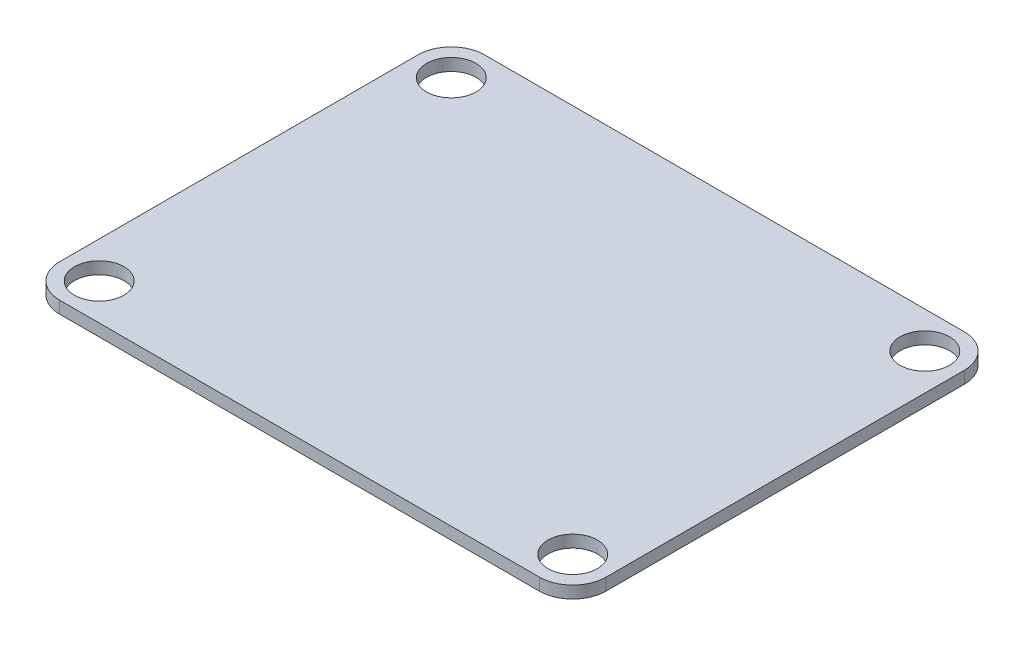
ISO-10303-21;
HEADER;
FILE_DESCRIPTION(('STEP AP214'),'2;1');
FILE_NAME('part.step','',(''),(''),'','','');
FILE_SCHEMA(('AUTOMOTIVE_DESIGN { 1 0 10303 214 1 1 1 1 }'));
ENDSEC;
DATA;
#1=APPLICATION_CONTEXT('core data for automotive mechanical design processes');
#2=APPLICATION_PROTOCOL_DEFINITION('international standard','automotive_design',2000,#1);
#3=PRODUCT_CONTEXT('',#1,'mechanical');
#4=PRODUCT('Part','Part','',(#3));
#5=PRODUCT_RELATED_PRODUCT_CATEGORY('part','',(#4));
#6=PRODUCT_DEFINITION_FORMATION('','',#4);
#7=PRODUCT_DEFINITION_CONTEXT('part definition',#1,'design');
#8=PRODUCT_DEFINITION('design','',#6,#7);
#9=PRODUCT_DEFINITION_SHAPE('','',#8);
#10=(LENGTH_UNIT() NAMED_UNIT(*) SI_UNIT(.MILLI.,.METRE.));
#11=(NAMED_UNIT(*) PLANE_ANGLE_UNIT() SI_UNIT($,.RADIAN.));
#12=(NAMED_UNIT(*) SI_UNIT($,.STERADIAN.) SOLID_ANGLE_UNIT());
#13=UNCERTAINTY_MEASURE_WITH_UNIT(LENGTH_MEASURE(1.E-05),#10,'distance_accuracy_value','');
#14=(GEOMETRIC_REPRESENTATION_CONTEXT(3) GLOBAL_UNCERTAINTY_ASSIGNED_CONTEXT((#13)) GLOBAL_UNIT_ASSIGNED_CONTEXT((#10,
#11,#12)) REPRESENTATION_CONTEXT('',''));
#15=CARTESIAN_POINT('',(0.,0.,0.));
#16=DIRECTION('',(0.,0.,1.));
#17=DIRECTION('',(1.,0.,0.));
#18=AXIS2_PLACEMENT_3D('',#15,#16,#17);
#19=CARTESIAN_POINT('',(114.3,5.08,-88.9));
#20=DIRECTION('',(-1.,0.,0.));
#21=DIRECTION('',(0.,0.,1.));
#22=AXIS2_PLACEMENT_3D('',#19,#20,#21);
#23=PLANE('',#22);
#24=DIRECTION('',(0.,0.,-1.));
#25=VECTOR('',#24,1.);
#26=CARTESIAN_POINT('',(114.3,0.,-88.9));
#27=LINE('',#26,#25);
#28=CARTESIAN_POINT('',(114.3,0.,74.93));
#29=VERTEX_POINT('',#28);
#30=CARTESIAN_POINT('',(114.3,0.,-74.93));
#31=VERTEX_POINT('',#30);
#32=EDGE_CURVE('E134',#29,#31,#27,.T.);
#33=ORIENTED_EDGE('',*,*,#32,.T.);
#34=DIRECTION('',(0.,-1.,0.));
#35=VECTOR('',#34,1.);
#36=CARTESIAN_POINT('',(114.3,5.08,-74.93));
#37=LINE('',#36,#35);
#38=CARTESIAN_POINT('',(114.3,5.08,-74.93));
#39=VERTEX_POINT('',#38);
#40=EDGE_CURVE('E111',#31,#39,#37,.F.);
#41=ORIENTED_EDGE('',*,*,#40,.T.);
#42=DIRECTION('',(0.,0.,-1.));
#43=VECTOR('',#42,1.);
#44=CARTESIAN_POINT('',(114.3,5.08,-88.9));
#45=LINE('',#44,#43);
#46=CARTESIAN_POINT('',(114.3,5.08,74.93));
#47=VERTEX_POINT('',#46);
#48=EDGE_CURVE('E144',#47,#39,#45,.T.);
#49=ORIENTED_EDGE('',*,*,#48,.F.);
#50=DIRECTION('',(0.,-1.,0.));
#51=VECTOR('',#50,1.);
#52=CARTESIAN_POINT('',(114.3,5.08,74.93));
#53=LINE('',#52,#51);
#54=EDGE_CURVE('E116',#47,#29,#53,.T.);
#55=ORIENTED_EDGE('',*,*,#54,.T.);
#56=EDGE_LOOP('',(#33,#41,#49,#55));
#57=FACE_BOUND('',#56,.T.);
#58=ADVANCED_FACE('F39',(#57),#23,.F.);
#59=CARTESIAN_POINT('',(-114.3,5.08,-88.9));
#60=DIRECTION('',(0.,0.,1.));
#61=DIRECTION('',(1.,0.,0.));
#62=AXIS2_PLACEMENT_3D('',#59,#60,#61);
#63=PLANE('',#62);
#64=DIRECTION('',(-1.,0.,0.));
#65=VECTOR('',#64,1.);
#66=CARTESIAN_POINT('',(-114.3,5.08,-88.9));
#67=LINE('',#66,#65);
#68=CARTESIAN_POINT('',(100.33,5.08,-88.9));
#69=VERTEX_POINT('',#68);
#70=CARTESIAN_POINT('',(-100.33,5.08,-88.9));
#71=VERTEX_POINT('',#70);
#72=EDGE_CURVE('E126',#69,#71,#67,.T.);
#73=ORIENTED_EDGE('',*,*,#72,.F.);
#74=DIRECTION('',(0.,-1.,0.));
#75=VECTOR('',#74,1.);
#76=CARTESIAN_POINT('',(100.33,5.08,-88.9));
#77=LINE('',#76,#75);
#78=CARTESIAN_POINT('',(100.33,0.,-88.9));
#79=VERTEX_POINT('',#78);
#80=EDGE_CURVE('E110',#69,#79,#77,.T.);
#81=ORIENTED_EDGE('',*,*,#80,.T.);
#82=DIRECTION('',(-1.,0.,0.));
#83=VECTOR('',#82,1.);
#84=CARTESIAN_POINT('',(-114.3,0.,-88.9));
#85=LINE('',#84,#83);
#86=CARTESIAN_POINT('',(-100.33,0.,-88.9));
#87=VERTEX_POINT('',#86);
#88=EDGE_CURVE('E123',#79,#87,#85,.T.);
#89=ORIENTED_EDGE('',*,*,#88,.T.);
#90=DIRECTION('',(0.,-1.,0.));
#91=VECTOR('',#90,1.);
#92=CARTESIAN_POINT('',(-100.33,5.08,-88.9));
#93=LINE('',#92,#91);
#94=EDGE_CURVE('E128',#87,#71,#93,.F.);
#95=ORIENTED_EDGE('',*,*,#94,.T.);
#96=EDGE_LOOP('',(#73,#81,#89,#95));
#97=FACE_BOUND('',#96,.T.);
#98=ADVANCED_FACE('F122',(#97),#63,.F.);
#99=CARTESIAN_POINT('',(-114.3,5.08,-88.9));
#100=DIRECTION('',(1.,0.,0.));
#101=DIRECTION('',(0.,0.,-1.));
#102=AXIS2_PLACEMENT_3D('',#99,#100,#101);
#103=PLANE('',#102);
#104=DIRECTION('',(0.,0.,1.));
#105=VECTOR('',#104,1.);
#106=CARTESIAN_POINT('',(-114.3,5.08,-88.9));
#107=LINE('',#106,#105);
#108=CARTESIAN_POINT('',(-114.3,5.08,-74.93));
#109=VERTEX_POINT('',#108);
#110=CARTESIAN_POINT('',(-114.3,5.08,74.93));
#111=VERTEX_POINT('',#110);
#112=EDGE_CURVE('E167',#109,#111,#107,.T.);
#113=ORIENTED_EDGE('',*,*,#112,.F.);
#114=DIRECTION('',(0.,-1.,0.));
#115=VECTOR('',#114,1.);
#116=CARTESIAN_POINT('',(-114.3,5.08,-74.93));
#117=LINE('',#116,#115);
#118=CARTESIAN_POINT('',(-114.3,0.,-74.93));
#119=VERTEX_POINT('',#118);
#120=EDGE_CURVE('E11',#109,#119,#117,.T.);
#121=ORIENTED_EDGE('',*,*,#120,.T.);
#122=DIRECTION('',(0.,0.,1.));
#123=VECTOR('',#122,1.);
#124=CARTESIAN_POINT('',(-114.3,0.,-88.9));
#125=LINE('',#124,#123);
#126=CARTESIAN_POINT('',(-114.3,0.,74.93));
#127=VERTEX_POINT('',#126);
#128=EDGE_CURVE('E133',#119,#127,#125,.T.);
#129=ORIENTED_EDGE('',*,*,#128,.T.);
#130=DIRECTION('',(0.,-1.,0.));
#131=VECTOR('',#130,1.);
#132=CARTESIAN_POINT('',(-114.3,5.08,74.93));
#133=LINE('',#132,#131);
#134=EDGE_CURVE('E47',#127,#111,#133,.F.);
#135=ORIENTED_EDGE('',*,*,#134,.T.);
#136=EDGE_LOOP('',(#113,#121,#129,#135));
#137=FACE_BOUND('',#136,.T.);
#138=ADVANCED_FACE('F166',(#137),#103,.F.);
#139=CARTESIAN_POINT('',(-114.3,5.08,88.9));
#140=DIRECTION('',(0.,0.,-1.));
#141=DIRECTION('',(-1.,0.,0.));
#142=AXIS2_PLACEMENT_3D('',#139,#140,#141);
#143=PLANE('',#142);
#144=DIRECTION('',(1.,0.,0.));
#145=VECTOR('',#144,1.);
#146=CARTESIAN_POINT('',(-114.3,0.,88.9));
#147=LINE('',#146,#145);
#148=CARTESIAN_POINT('',(-100.33,0.,88.9));
#149=VERTEX_POINT('',#148);
#150=CARTESIAN_POINT('',(100.33,0.,88.9));
#151=VERTEX_POINT('',#150);
#152=EDGE_CURVE('E137',#149,#151,#147,.T.);
#153=ORIENTED_EDGE('',*,*,#152,.T.);
#154=DIRECTION('',(0.,-1.,0.));
#155=VECTOR('',#154,1.);
#156=CARTESIAN_POINT('',(100.33,5.08,88.9));
#157=LINE('',#156,#155);
#158=CARTESIAN_POINT('',(100.33,5.08,88.9));
#159=VERTEX_POINT('',#158);
#160=EDGE_CURVE('E54',#151,#159,#157,.F.);
#161=ORIENTED_EDGE('',*,*,#160,.T.);
#162=DIRECTION('',(1.,0.,0.));
#163=VECTOR('',#162,1.);
#164=CARTESIAN_POINT('',(-114.3,5.08,88.9));
#165=LINE('',#164,#163);
#166=CARTESIAN_POINT('',(-100.33,5.08,88.9));
#167=VERTEX_POINT('',#166);
#168=EDGE_CURVE('E145',#167,#159,#165,.T.);
#169=ORIENTED_EDGE('',*,*,#168,.F.);
#170=DIRECTION('',(0.,-1.,0.));
#171=VECTOR('',#170,1.);
#172=CARTESIAN_POINT('',(-100.33,5.08,88.9));
#173=LINE('',#172,#171);
#174=EDGE_CURVE('E160',#167,#149,#173,.T.);
#175=ORIENTED_EDGE('',*,*,#174,.T.);
#176=EDGE_LOOP('',(#153,#161,#169,#175));
#177=FACE_BOUND('',#176,.T.);
#178=ADVANCED_FACE('F176',(#177),#143,.F.);
#179=CARTESIAN_POINT('',(0.,5.08,0.));
#180=DIRECTION('',(0.,1.,0.));
#181=DIRECTION('',(0.,0.,1.));
#182=AXIS2_PLACEMENT_3D('',#179,#180,#181);
#183=PLANE('',#182);
#184=CARTESIAN_POINT('',(-99.06,5.08,73.66));
#185=DIRECTION('',(0.,1.,0.));
#186=DIRECTION('',(0.,0.,1.));
#187=AXIS2_PLACEMENT_3D('',#184,#185,#186);
#188=CIRCLE('',#187,10.3505);
#189=CARTESIAN_POINT('',(-99.06,5.08,84.0105));
#190=VERTEX_POINT('',#189);
#191=EDGE_CURVE('E195',#190,#190,#188,.T.);
#192=ORIENTED_EDGE('',*,*,#191,.F.);
#193=EDGE_LOOP('',(#192));
#194=FACE_BOUND('',#193,.T.);
#195=CARTESIAN_POINT('',(99.06,5.08,73.66));
#196=DIRECTION('',(0.,1.,0.));
#197=DIRECTION('',(0.,0.,1.));
#198=AXIS2_PLACEMENT_3D('',#195,#196,#197);
#199=CIRCLE('',#198,10.3505);
#200=CARTESIAN_POINT('',(99.06,5.08,84.0105));
#201=VERTEX_POINT('',#200);
#202=EDGE_CURVE('E201',#201,#201,#199,.T.);
#203=ORIENTED_EDGE('',*,*,#202,.F.);
#204=EDGE_LOOP('',(#203));
#205=FACE_BOUND('',#204,.T.);
#206=CARTESIAN_POINT('',(99.06,5.08,-73.66));
#207=DIRECTION('',(0.,1.,0.));
#208=DIRECTION('',(0.,0.,1.));
#209=AXIS2_PLACEMENT_3D('',#206,#207,#208);
#210=CIRCLE('',#209,10.3505);
#211=CARTESIAN_POINT('',(99.06,5.08,-63.3095));
#212=VERTEX_POINT('',#211);
#213=EDGE_CURVE('E189',#212,#212,#210,.T.);
#214=ORIENTED_EDGE('',*,*,#213,.F.);
#215=EDGE_LOOP('',(#214));
#216=FACE_BOUND('',#215,.T.);
#217=CARTESIAN_POINT('',(-99.06,5.08,-73.66));
#218=DIRECTION('',(0.,1.,0.));
#219=DIRECTION('',(0.,0.,1.));
#220=AXIS2_PLACEMENT_3D('',#217,#218,#219);
#221=CIRCLE('',#220,10.3505);
#222=CARTESIAN_POINT('',(-99.06,5.08,-63.3095));
#223=VERTEX_POINT('',#222);
#224=EDGE_CURVE('E186',#223,#223,#221,.T.);
#225=ORIENTED_EDGE('',*,*,#224,.F.);
#226=EDGE_LOOP('',(#225));
#227=FACE_BOUND('',#226,.T.);
#228=ORIENTED_EDGE('',*,*,#48,.T.);
#229=CARTESIAN_POINT('',(100.33,5.08,-74.93));
#230=DIRECTION('',(0.,1.,0.));
#231=DIRECTION('',(0.,0.,1.));
#232=AXIS2_PLACEMENT_3D('',#229,#230,#231);
#233=CIRCLE('',#232,13.97);
#234=EDGE_CURVE('E158',#39,#69,#233,.T.);
#235=ORIENTED_EDGE('',*,*,#234,.T.);
#236=ORIENTED_EDGE('',*,*,#72,.T.);
#237=CARTESIAN_POINT('',(-100.33,5.08,-74.93));
#238=DIRECTION('',(0.,1.,0.));
#239=DIRECTION('',(0.,0.,1.));
#240=AXIS2_PLACEMENT_3D('',#237,#238,#239);
#241=CIRCLE('',#240,13.97);
#242=EDGE_CURVE('E154',#71,#109,#241,.T.);
#243=ORIENTED_EDGE('',*,*,#242,.T.);
#244=ORIENTED_EDGE('',*,*,#112,.T.);
#245=CARTESIAN_POINT('',(-100.33,5.08,74.93));
#246=DIRECTION('',(0.,1.,0.));
#247=DIRECTION('',(0.,0.,1.));
#248=AXIS2_PLACEMENT_3D('',#245,#246,#247);
#249=CIRCLE('',#248,13.97);
#250=EDGE_CURVE('E61',#111,#167,#249,.T.);
#251=ORIENTED_EDGE('',*,*,#250,.T.);
#252=ORIENTED_EDGE('',*,*,#168,.T.);
#253=CARTESIAN_POINT('',(100.33,5.08,74.93));
#254=DIRECTION('',(0.,1.,0.));
#255=DIRECTION('',(0.,0.,1.));
#256=AXIS2_PLACEMENT_3D('',#253,#254,#255);
#257=CIRCLE('',#256,13.97);
#258=EDGE_CURVE('E156',#159,#47,#257,.T.);
#259=ORIENTED_EDGE('',*,*,#258,.T.);
#260=EDGE_LOOP('',(#228,#235,#236,#243,#244,#251,#252,#259));
#261=FACE_BOUND('',#260,.T.);
#262=ADVANCED_FACE('F171',(#194,#205,#216,#227,#261),#183,.T.);
#263=CARTESIAN_POINT('',(0.,0.,0.));
#264=DIRECTION('',(0.,1.,0.));
#265=DIRECTION('',(0.,0.,1.));
#266=AXIS2_PLACEMENT_3D('',#263,#264,#265);
#267=PLANE('',#266);
#268=CARTESIAN_POINT('',(-99.06,0.,73.66));
#269=DIRECTION('',(0.,1.,0.));
#270=DIRECTION('',(0.,0.,1.));
#271=AXIS2_PLACEMENT_3D('',#268,#269,#270);
#272=CIRCLE('',#271,10.3505);
#273=CARTESIAN_POINT('',(-99.06,0.,84.0105));
#274=VERTEX_POINT('',#273);
#275=EDGE_CURVE('E192',#274,#274,#272,.T.);
#276=ORIENTED_EDGE('',*,*,#275,.T.);
#277=EDGE_LOOP('',(#276));
#278=FACE_BOUND('',#277,.T.);
#279=CARTESIAN_POINT('',(99.06,0.,73.66));
#280=DIRECTION('',(0.,1.,0.));
#281=DIRECTION('',(0.,0.,1.));
#282=AXIS2_PLACEMENT_3D('',#279,#280,#281);
#283=CIRCLE('',#282,10.3505);
#284=CARTESIAN_POINT('',(99.06,0.,84.0105));
#285=VERTEX_POINT('',#284);
#286=EDGE_CURVE('E198',#285,#285,#283,.T.);
#287=ORIENTED_EDGE('',*,*,#286,.T.);
#288=EDGE_LOOP('',(#287));
#289=FACE_BOUND('',#288,.T.);
#290=CARTESIAN_POINT('',(99.06,0.,-73.66));
#291=DIRECTION('',(0.,1.,0.));
#292=DIRECTION('',(0.,0.,1.));
#293=AXIS2_PLACEMENT_3D('',#290,#291,#292);
#294=CIRCLE('',#293,10.3505);
#295=CARTESIAN_POINT('',(99.06,0.,-63.3095));
#296=VERTEX_POINT('',#295);
#297=EDGE_CURVE('E204',#296,#296,#294,.T.);
#298=ORIENTED_EDGE('',*,*,#297,.T.);
#299=EDGE_LOOP('',(#298));
#300=FACE_BOUND('',#299,.T.);
#301=CARTESIAN_POINT('',(-99.06,0.,-73.66));
#302=DIRECTION('',(0.,1.,0.));
#303=DIRECTION('',(0.,0.,1.));
#304=AXIS2_PLACEMENT_3D('',#301,#302,#303);
#305=CIRCLE('',#304,10.3505);
#306=CARTESIAN_POINT('',(-99.06,0.,-63.3095));
#307=VERTEX_POINT('',#306);
#308=EDGE_CURVE('E139',#307,#307,#305,.T.);
#309=ORIENTED_EDGE('',*,*,#308,.T.);
#310=EDGE_LOOP('',(#309));
#311=FACE_BOUND('',#310,.T.);
#312=ORIENTED_EDGE('',*,*,#88,.F.);
#313=CARTESIAN_POINT('',(100.33,0.,-74.93));
#314=DIRECTION('',(0.,1.,0.));
#315=DIRECTION('',(0.,0.,1.));
#316=AXIS2_PLACEMENT_3D('',#313,#314,#315);
#317=CIRCLE('',#316,13.97);
#318=EDGE_CURVE('E106',#79,#31,#317,.F.);
#319=ORIENTED_EDGE('',*,*,#318,.T.);
#320=ORIENTED_EDGE('',*,*,#32,.F.);
#321=CARTESIAN_POINT('',(100.33,0.,74.93));
#322=DIRECTION('',(0.,1.,0.));
#323=DIRECTION('',(0.,0.,1.));
#324=AXIS2_PLACEMENT_3D('',#321,#322,#323);
#325=CIRCLE('',#324,13.97);
#326=EDGE_CURVE('E117',#29,#151,#325,.F.);
#327=ORIENTED_EDGE('',*,*,#326,.T.);
#328=ORIENTED_EDGE('',*,*,#152,.F.);
#329=CARTESIAN_POINT('',(-100.33,0.,74.93));
#330=DIRECTION('',(0.,1.,0.));
#331=DIRECTION('',(0.,0.,1.));
#332=AXIS2_PLACEMENT_3D('',#329,#330,#331);
#333=CIRCLE('',#332,13.97);
#334=EDGE_CURVE('E127',#149,#127,#333,.F.);
#335=ORIENTED_EDGE('',*,*,#334,.T.);
#336=ORIENTED_EDGE('',*,*,#128,.F.);
#337=CARTESIAN_POINT('',(-100.33,0.,-74.93));
#338=DIRECTION('',(0.,1.,0.));
#339=DIRECTION('',(0.,0.,1.));
#340=AXIS2_PLACEMENT_3D('',#337,#338,#339);
#341=CIRCLE('',#340,13.97);
#342=EDGE_CURVE('E132',#119,#87,#341,.F.);
#343=ORIENTED_EDGE('',*,*,#342,.T.);
#344=EDGE_LOOP('',(#312,#319,#320,#327,#328,#335,#336,#343));
#345=FACE_BOUND('',#344,.T.);
#346=ADVANCED_FACE('F130',(#278,#289,#300,#311,#345),#267,.F.);
#347=CARTESIAN_POINT('',(-99.06,0.,-73.66));
#348=DIRECTION('',(0.,1.,0.));
#349=DIRECTION('',(0.,0.,1.));
#350=AXIS2_PLACEMENT_3D('',#347,#348,#349);
#351=CYLINDRICAL_SURFACE('',#350,10.3505);
#352=ORIENTED_EDGE('',*,*,#308,.F.);
#353=EDGE_LOOP('',(#352));
#354=FACE_BOUND('',#353,.T.);
#355=ORIENTED_EDGE('',*,*,#224,.T.);
#356=EDGE_LOOP('',(#355));
#357=FACE_BOUND('',#356,.T.);
#358=ADVANCED_FACE('F218',(#354,#357),#351,.F.);
#359=CARTESIAN_POINT('',(99.06,0.,-73.66));
#360=DIRECTION('',(0.,1.,0.));
#361=DIRECTION('',(0.,0.,1.));
#362=AXIS2_PLACEMENT_3D('',#359,#360,#361);
#363=CYLINDRICAL_SURFACE('',#362,10.3505);
#364=ORIENTED_EDGE('',*,*,#297,.F.);
#365=EDGE_LOOP('',(#364));
#366=FACE_BOUND('',#365,.T.);
#367=ORIENTED_EDGE('',*,*,#213,.T.);
#368=EDGE_LOOP('',(#367));
#369=FACE_BOUND('',#368,.T.);
#370=ADVANCED_FACE('F210',(#366,#369),#363,.F.);
#371=CARTESIAN_POINT('',(99.06,0.,73.66));
#372=DIRECTION('',(0.,1.,0.));
#373=DIRECTION('',(0.,0.,1.));
#374=AXIS2_PLACEMENT_3D('',#371,#372,#373);
#375=CYLINDRICAL_SURFACE('',#374,10.3505);
#376=ORIENTED_EDGE('',*,*,#286,.F.);
#377=EDGE_LOOP('',(#376));
#378=FACE_BOUND('',#377,.T.);
#379=ORIENTED_EDGE('',*,*,#202,.T.);
#380=EDGE_LOOP('',(#379));
#381=FACE_BOUND('',#380,.T.);
#382=ADVANCED_FACE('F225',(#378,#381),#375,.F.);
#383=CARTESIAN_POINT('',(-99.06,0.,73.66));
#384=DIRECTION('',(0.,1.,0.));
#385=DIRECTION('',(0.,0.,1.));
#386=AXIS2_PLACEMENT_3D('',#383,#384,#385);
#387=CYLINDRICAL_SURFACE('',#386,10.3505);
#388=ORIENTED_EDGE('',*,*,#275,.F.);
#389=EDGE_LOOP('',(#388));
#390=FACE_BOUND('',#389,.T.);
#391=ORIENTED_EDGE('',*,*,#191,.T.);
#392=EDGE_LOOP('',(#391));
#393=FACE_BOUND('',#392,.T.);
#394=ADVANCED_FACE('F244',(#390,#393),#387,.F.);
#395=CARTESIAN_POINT('',(100.33,5.08,-74.93));
#396=DIRECTION('',(0.,-1.,0.));
#397=DIRECTION('',(0.,0.,-1.));
#398=AXIS2_PLACEMENT_3D('',#395,#396,#397);
#399=CYLINDRICAL_SURFACE('',#398,13.97);
#400=ORIENTED_EDGE('',*,*,#234,.F.);
#401=ORIENTED_EDGE('',*,*,#40,.F.);
#402=ORIENTED_EDGE('',*,*,#318,.F.);
#403=ORIENTED_EDGE('',*,*,#80,.F.);
#404=EDGE_LOOP('',(#400,#401,#402,#403));
#405=FACE_BOUND('',#404,.T.);
#406=ADVANCED_FACE('F109',(#405),#399,.T.);
#407=CARTESIAN_POINT('',(100.33,5.08,74.93));
#408=DIRECTION('',(0.,-1.,0.));
#409=DIRECTION('',(0.,0.,-1.));
#410=AXIS2_PLACEMENT_3D('',#407,#408,#409);
#411=CYLINDRICAL_SURFACE('',#410,13.97);
#412=ORIENTED_EDGE('',*,*,#258,.F.);
#413=ORIENTED_EDGE('',*,*,#160,.F.);
#414=ORIENTED_EDGE('',*,*,#326,.F.);
#415=ORIENTED_EDGE('',*,*,#54,.F.);
#416=EDGE_LOOP('',(#412,#413,#414,#415));
#417=FACE_BOUND('',#416,.T.);
#418=ADVANCED_FACE('F180',(#417),#411,.T.);
#419=CARTESIAN_POINT('',(-100.33,5.08,-74.93));
#420=DIRECTION('',(0.,-1.,0.));
#421=DIRECTION('',(0.,0.,-1.));
#422=AXIS2_PLACEMENT_3D('',#419,#420,#421);
#423=CYLINDRICAL_SURFACE('',#422,13.97);
#424=ORIENTED_EDGE('',*,*,#242,.F.);
#425=ORIENTED_EDGE('',*,*,#94,.F.);
#426=ORIENTED_EDGE('',*,*,#342,.F.);
#427=ORIENTED_EDGE('',*,*,#120,.F.);
#428=EDGE_LOOP('',(#424,#425,#426,#427));
#429=FACE_BOUND('',#428,.T.);
#430=ADVANCED_FACE('F246',(#429),#423,.T.);
#431=CARTESIAN_POINT('',(-100.33,5.08,74.93));
#432=DIRECTION('',(0.,-1.,0.));
#433=DIRECTION('',(0.,0.,-1.));
#434=AXIS2_PLACEMENT_3D('',#431,#432,#433);
#435=CYLINDRICAL_SURFACE('',#434,13.97);
#436=ORIENTED_EDGE('',*,*,#250,.F.);
#437=ORIENTED_EDGE('',*,*,#134,.F.);
#438=ORIENTED_EDGE('',*,*,#334,.F.);
#439=ORIENTED_EDGE('',*,*,#174,.F.);
#440=EDGE_LOOP('',(#436,#437,#438,#439));
#441=FACE_BOUND('',#440,.T.);
#442=ADVANCED_FACE('F41',(#441),#435,.T.);
#443=CLOSED_SHELL('',(#58,#98,#138,#178,#262,#346,#358,#370,#382,#394,#406,#418,#430,#442));
#444=MANIFOLD_SOLID_BREP('B2',#443);
#445=ADVANCED_BREP_SHAPE_REPRESENTATION('',(#18,#444),#14);
#446=SHAPE_DEFINITION_REPRESENTATION(#9,#445);
ENDSEC;
END-ISO-10303-21;
